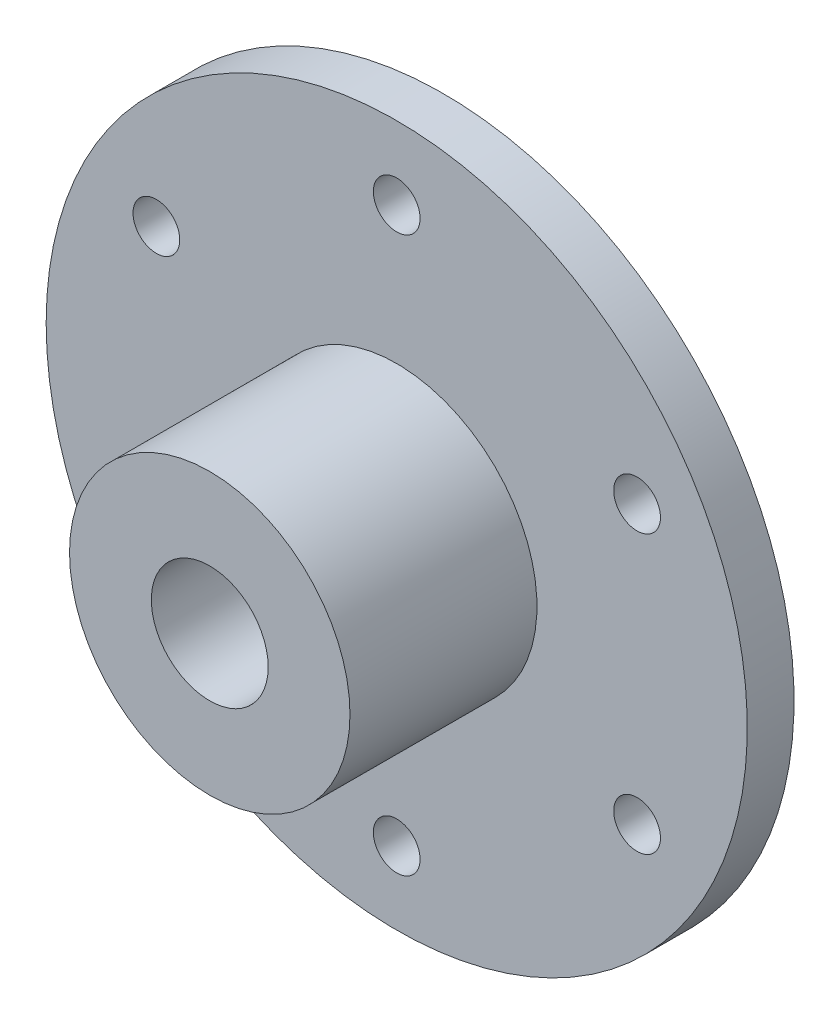
ISO-10303-21;
HEADER;
FILE_DESCRIPTION(('STEP AP214'),'2;1');
FILE_NAME('part.step','',(''),(''),'','','');
FILE_SCHEMA(('AUTOMOTIVE_DESIGN { 1 0 10303 214 1 1 1 1 }'));
ENDSEC;
DATA;
#1=APPLICATION_CONTEXT('core data for automotive mechanical design processes');
#2=APPLICATION_PROTOCOL_DEFINITION('international standard','automotive_design',2000,#1);
#3=PRODUCT_CONTEXT('',#1,'mechanical');
#4=PRODUCT('Part','Part','',(#3));
#5=PRODUCT_RELATED_PRODUCT_CATEGORY('part','',(#4));
#6=PRODUCT_DEFINITION_FORMATION('','',#4);
#7=PRODUCT_DEFINITION_CONTEXT('part definition',#1,'design');
#8=PRODUCT_DEFINITION('design','',#6,#7);
#9=PRODUCT_DEFINITION_SHAPE('','',#8);
#10=(LENGTH_UNIT() NAMED_UNIT(*) SI_UNIT(.MILLI.,.METRE.));
#11=(NAMED_UNIT(*) PLANE_ANGLE_UNIT() SI_UNIT($,.RADIAN.));
#12=(NAMED_UNIT(*) SI_UNIT($,.STERADIAN.) SOLID_ANGLE_UNIT());
#13=UNCERTAINTY_MEASURE_WITH_UNIT(LENGTH_MEASURE(1.E-05),#10,'distance_accuracy_value','');
#14=(GEOMETRIC_REPRESENTATION_CONTEXT(3) GLOBAL_UNCERTAINTY_ASSIGNED_CONTEXT((#13)) GLOBAL_UNIT_ASSIGNED_CONTEXT((#10,
#11,#12)) REPRESENTATION_CONTEXT('',''));
#15=CARTESIAN_POINT('',(0.,0.,0.));
#16=DIRECTION('',(0.,0.,1.));
#17=DIRECTION('',(1.,0.,0.));
#18=AXIS2_PLACEMENT_3D('',#15,#16,#17);
#19=CARTESIAN_POINT('',(0.,0.,-4.));
#20=DIRECTION('',(0.,0.,1.));
#21=DIRECTION('',(1.,0.,0.));
#22=AXIS2_PLACEMENT_3D('',#19,#20,#21);
#23=CYLINDRICAL_SURFACE('',#22,30.);
#24=CARTESIAN_POINT('',(0.,0.,-4.));
#25=DIRECTION('',(0.,0.,1.));
#26=DIRECTION('',(-1.,0.,0.));
#27=AXIS2_PLACEMENT_3D('',#24,#25,#26);
#28=CIRCLE('',#27,30.);
#29=CARTESIAN_POINT('',(-30.,0.,-4.));
#30=VERTEX_POINT('',#29);
#31=EDGE_CURVE('E45',#30,#30,#28,.T.);
#32=ORIENTED_EDGE('',*,*,#31,.T.);
#33=EDGE_LOOP('',(#32));
#34=FACE_BOUND('',#33,.T.);
#35=CARTESIAN_POINT('',(0.,0.,0.));
#36=DIRECTION('',(0.,0.,1.));
#37=DIRECTION('',(-1.,0.,0.));
#38=AXIS2_PLACEMENT_3D('',#35,#36,#37);
#39=CIRCLE('',#38,30.);
#40=CARTESIAN_POINT('',(-30.,0.,0.));
#41=VERTEX_POINT('',#40);
#42=EDGE_CURVE('E49',#41,#41,#39,.T.);
#43=ORIENTED_EDGE('',*,*,#42,.F.);
#44=EDGE_LOOP('',(#43));
#45=FACE_BOUND('',#44,.T.);
#46=ADVANCED_FACE('F31',(#34,#45),#23,.T.);
#47=CARTESIAN_POINT('',(0.,0.,-4.));
#48=DIRECTION('',(0.,0.,-1.));
#49=DIRECTION('',(-1.,0.,0.));
#50=AXIS2_PLACEMENT_3D('',#47,#48,#49);
#51=PLANE('',#50);
#52=CARTESIAN_POINT('',(0.,0.,-4.));
#53=DIRECTION('',(0.,0.,1.));
#54=DIRECTION('',(1.,0.,0.));
#55=AXIS2_PLACEMENT_3D('',#52,#53,#54);
#56=CIRCLE('',#55,4.99999999999999);
#57=CARTESIAN_POINT('',(4.99999999999999,0.,-4.));
#58=VERTEX_POINT('',#57);
#59=EDGE_CURVE('E93',#58,#58,#56,.T.);
#60=ORIENTED_EDGE('',*,*,#59,.T.);
#61=EDGE_LOOP('',(#60));
#62=FACE_BOUND('',#61,.T.);
#63=CARTESIAN_POINT('',(20.5681033398804,-11.875,-4.));
#64=DIRECTION('',(0.,0.,1.));
#65=DIRECTION('',(1.,0.,0.));
#66=AXIS2_PLACEMENT_3D('',#63,#64,#65);
#67=CIRCLE('',#66,1.99999999999999);
#68=CARTESIAN_POINT('',(22.5681033398804,-11.875,-4.));
#69=VERTEX_POINT('',#68);
#70=EDGE_CURVE('E87',#69,#69,#67,.T.);
#71=ORIENTED_EDGE('',*,*,#70,.T.);
#72=EDGE_LOOP('',(#71));
#73=FACE_BOUND('',#72,.T.);
#74=CARTESIAN_POINT('',(0.,23.75,-4.));
#75=DIRECTION('',(0.,0.,1.));
#76=DIRECTION('',(1.,0.,0.));
#77=AXIS2_PLACEMENT_3D('',#74,#75,#76);
#78=CIRCLE('',#77,1.99999999999999);
#79=CARTESIAN_POINT('',(1.99999999999999,23.75,-4.));
#80=VERTEX_POINT('',#79);
#81=EDGE_CURVE('E81',#80,#80,#78,.T.);
#82=ORIENTED_EDGE('',*,*,#81,.T.);
#83=EDGE_LOOP('',(#82));
#84=FACE_BOUND('',#83,.T.);
#85=CARTESIAN_POINT('',(0.,-23.75,-4.));
#86=DIRECTION('',(0.,0.,1.));
#87=DIRECTION('',(1.,0.,0.));
#88=AXIS2_PLACEMENT_3D('',#85,#86,#87);
#89=CIRCLE('',#88,1.99999999999999);
#90=CARTESIAN_POINT('',(1.99999999999999,-23.75,-4.));
#91=VERTEX_POINT('',#90);
#92=EDGE_CURVE('E75',#91,#91,#89,.T.);
#93=ORIENTED_EDGE('',*,*,#92,.T.);
#94=EDGE_LOOP('',(#93));
#95=FACE_BOUND('',#94,.T.);
#96=CARTESIAN_POINT('',(20.5681033398804,11.875,-4.));
#97=DIRECTION('',(0.,0.,1.));
#98=DIRECTION('',(1.,0.,0.));
#99=AXIS2_PLACEMENT_3D('',#96,#97,#98);
#100=CIRCLE('',#99,1.99999999999999);
#101=CARTESIAN_POINT('',(22.5681033398804,11.875,-4.));
#102=VERTEX_POINT('',#101);
#103=EDGE_CURVE('E69',#102,#102,#100,.T.);
#104=ORIENTED_EDGE('',*,*,#103,.T.);
#105=EDGE_LOOP('',(#104));
#106=FACE_BOUND('',#105,.T.);
#107=CARTESIAN_POINT('',(-20.5681033398804,11.875,-4.));
#108=DIRECTION('',(0.,0.,1.));
#109=DIRECTION('',(1.,0.,0.));
#110=AXIS2_PLACEMENT_3D('',#107,#108,#109);
#111=CIRCLE('',#110,1.99999999999999);
#112=CARTESIAN_POINT('',(-18.5681033398804,11.875,-4.));
#113=VERTEX_POINT('',#112);
#114=EDGE_CURVE('E63',#113,#113,#111,.T.);
#115=ORIENTED_EDGE('',*,*,#114,.T.);
#116=EDGE_LOOP('',(#115));
#117=FACE_BOUND('',#116,.T.);
#118=CARTESIAN_POINT('',(-20.5681033398804,-11.875,-4.));
#119=DIRECTION('',(0.,0.,1.));
#120=DIRECTION('',(1.,0.,0.));
#121=AXIS2_PLACEMENT_3D('',#118,#119,#120);
#122=CIRCLE('',#121,1.99999999999999);
#123=CARTESIAN_POINT('',(-18.5681033398804,-11.875,-4.));
#124=VERTEX_POINT('',#123);
#125=EDGE_CURVE('E57',#124,#124,#122,.T.);
#126=ORIENTED_EDGE('',*,*,#125,.T.);
#127=EDGE_LOOP('',(#126));
#128=FACE_BOUND('',#127,.T.);
#129=ORIENTED_EDGE('',*,*,#31,.F.);
#130=EDGE_LOOP('',(#129));
#131=FACE_BOUND('',#130,.T.);
#132=ADVANCED_FACE('F151',(#62,#73,#84,#95,#106,#117,#128,#131),#51,.T.);
#133=CARTESIAN_POINT('',(0.,0.,0.));
#134=DIRECTION('',(0.,0.,-1.));
#135=DIRECTION('',(-1.,0.,0.));
#136=AXIS2_PLACEMENT_3D('',#133,#134,#135);
#137=PLANE('',#136);
#138=CARTESIAN_POINT('',(20.5681033398804,-11.875,0.));
#139=DIRECTION('',(0.,0.,1.));
#140=DIRECTION('',(1.,0.,0.));
#141=AXIS2_PLACEMENT_3D('',#138,#139,#140);
#142=CIRCLE('',#141,1.99999999999999);
#143=CARTESIAN_POINT('',(22.5681033398804,-11.875,0.));
#144=VERTEX_POINT('',#143);
#145=EDGE_CURVE('E90',#144,#144,#142,.T.);
#146=ORIENTED_EDGE('',*,*,#145,.F.);
#147=EDGE_LOOP('',(#146));
#148=FACE_BOUND('',#147,.T.);
#149=CARTESIAN_POINT('',(0.,23.75,0.));
#150=DIRECTION('',(0.,0.,1.));
#151=DIRECTION('',(1.,0.,0.));
#152=AXIS2_PLACEMENT_3D('',#149,#150,#151);
#153=CIRCLE('',#152,1.99999999999999);
#154=CARTESIAN_POINT('',(1.99999999999999,23.75,0.));
#155=VERTEX_POINT('',#154);
#156=EDGE_CURVE('E84',#155,#155,#153,.T.);
#157=ORIENTED_EDGE('',*,*,#156,.F.);
#158=EDGE_LOOP('',(#157));
#159=FACE_BOUND('',#158,.T.);
#160=CARTESIAN_POINT('',(0.,-23.75,0.));
#161=DIRECTION('',(0.,0.,1.));
#162=DIRECTION('',(1.,0.,0.));
#163=AXIS2_PLACEMENT_3D('',#160,#161,#162);
#164=CIRCLE('',#163,1.99999999999999);
#165=CARTESIAN_POINT('',(1.99999999999999,-23.75,0.));
#166=VERTEX_POINT('',#165);
#167=EDGE_CURVE('E78',#166,#166,#164,.T.);
#168=ORIENTED_EDGE('',*,*,#167,.F.);
#169=EDGE_LOOP('',(#168));
#170=FACE_BOUND('',#169,.T.);
#171=CARTESIAN_POINT('',(20.5681033398804,11.875,0.));
#172=DIRECTION('',(0.,0.,1.));
#173=DIRECTION('',(1.,0.,0.));
#174=AXIS2_PLACEMENT_3D('',#171,#172,#173);
#175=CIRCLE('',#174,1.99999999999999);
#176=CARTESIAN_POINT('',(22.5681033398804,11.875,0.));
#177=VERTEX_POINT('',#176);
#178=EDGE_CURVE('E72',#177,#177,#175,.T.);
#179=ORIENTED_EDGE('',*,*,#178,.F.);
#180=EDGE_LOOP('',(#179));
#181=FACE_BOUND('',#180,.T.);
#182=CARTESIAN_POINT('',(-20.5681033398804,11.875,0.));
#183=DIRECTION('',(0.,0.,1.));
#184=DIRECTION('',(1.,0.,0.));
#185=AXIS2_PLACEMENT_3D('',#182,#183,#184);
#186=CIRCLE('',#185,1.99999999999999);
#187=CARTESIAN_POINT('',(-18.5681033398804,11.875,0.));
#188=VERTEX_POINT('',#187);
#189=EDGE_CURVE('E66',#188,#188,#186,.T.);
#190=ORIENTED_EDGE('',*,*,#189,.F.);
#191=EDGE_LOOP('',(#190));
#192=FACE_BOUND('',#191,.T.);
#193=CARTESIAN_POINT('',(-20.5681033398804,-11.875,0.));
#194=DIRECTION('',(0.,0.,1.));
#195=DIRECTION('',(1.,0.,0.));
#196=AXIS2_PLACEMENT_3D('',#193,#194,#195);
#197=CIRCLE('',#196,1.99999999999999);
#198=CARTESIAN_POINT('',(-18.5681033398804,-11.875,0.));
#199=VERTEX_POINT('',#198);
#200=EDGE_CURVE('E60',#199,#199,#197,.T.);
#201=ORIENTED_EDGE('',*,*,#200,.F.);
#202=EDGE_LOOP('',(#201));
#203=FACE_BOUND('',#202,.T.);
#204=CARTESIAN_POINT('',(0.,0.,0.));
#205=DIRECTION('',(0.,0.,-1.));
#206=DIRECTION('',(-1.,0.,0.));
#207=AXIS2_PLACEMENT_3D('',#204,#205,#206);
#208=CIRCLE('',#207,12.);
#209=CARTESIAN_POINT('',(-12.,0.,0.));
#210=VERTEX_POINT('',#209);
#211=EDGE_CURVE('E41',#210,#210,#208,.F.);
#212=ORIENTED_EDGE('',*,*,#211,.F.);
#213=EDGE_LOOP('',(#212));
#214=FACE_BOUND('',#213,.T.);
#215=ORIENTED_EDGE('',*,*,#42,.T.);
#216=EDGE_LOOP('',(#215));
#217=FACE_BOUND('',#216,.T.);
#218=ADVANCED_FACE('F146',(#148,#159,#170,#181,#192,#203,#214,#217),#137,.F.);
#219=CARTESIAN_POINT('',(0.,0.,16.));
#220=DIRECTION('',(0.,0.,-1.));
#221=DIRECTION('',(-1.,0.,0.));
#222=AXIS2_PLACEMENT_3D('',#219,#220,#221);
#223=CYLINDRICAL_SURFACE('',#222,12.);
#224=CARTESIAN_POINT('',(0.,-12.,9.99999999999999));
#225=CARTESIAN_POINT('',(0.111512723966572,-11.9999980893506,9.99999552884174));
#226=CARTESIAN_POINT('',(0.223086305471056,-11.9984294233043,9.99064218002485));
#227=CARTESIAN_POINT('',(0.443104177338432,-11.9923227595311,9.95349147298773));
#228=CARTESIAN_POINT('',(0.551545494367395,-11.9877820313911,9.92567715447071));
#229=CARTESIAN_POINT('',(0.762083797770111,-11.9762405458916,9.85246764112579));
#230=CARTESIAN_POINT('',(0.864185894745516,-11.9692418012735,9.80708682748753));
#231=CARTESIAN_POINT('',(1.05931347358235,-11.9535538166566,9.70007016635807));
#232=CARTESIAN_POINT('',(1.15233999190287,-11.9448647700355,9.63843617801359));
#233=CARTESIAN_POINT('',(1.32757809143334,-11.9266665396665,9.50003593294362));
#234=CARTESIAN_POINT('',(1.40969032282797,-11.9171509745189,9.42314470829109));
#235=CARTESIAN_POINT('',(1.55991079892793,-11.8984210150139,9.25668162522174));
#236=CARTESIAN_POINT('',(1.62801815951277,-11.8892066397013,9.1671089668347));
#237=CARTESIAN_POINT('',(1.7486937004841,-11.8720605260782,8.97714322704235));
#238=CARTESIAN_POINT('',(1.80116364228879,-11.8641370327331,8.87668693055619));
#239=CARTESIAN_POINT('',(1.88844669232896,-11.8505583183574,8.6682323485595));
#240=CARTESIAN_POINT('',(1.92326099325248,-11.8449029441145,8.56023457305789));
#241=CARTESIAN_POINT('',(1.97393150222783,-11.836564294742,8.34081578011477));
#242=CARTESIAN_POINT('',(1.98995922330831,-11.8338541478856,8.22943541079889));
#243=CARTESIAN_POINT('',(2.00313338023189,-11.8316315114932,8.00553577849322));
#244=CARTESIAN_POINT('',(2.00028115231119,-11.8321187956577,7.89301659666616));
#245=CARTESIAN_POINT('',(1.97591607871691,-11.8362114309084,7.67125771097964));
#246=CARTESIAN_POINT('',(1.95459590551181,-11.8397845865513,7.56199615716382));
#247=CARTESIAN_POINT('',(1.89420251232274,-11.8495959616881,7.3486229457367));
#248=CARTESIAN_POINT('',(1.85512868345578,-11.8558342725862,7.24451146488917));
#249=CARTESIAN_POINT('',(1.76014179687512,-11.8703078346728,7.04381694124727));
#250=CARTESIAN_POINT('',(1.70414873110376,-11.8785525368586,6.94727247513503));
#251=CARTESIAN_POINT('',(1.57696961404594,-11.8961033473201,6.7648764795693));
#252=CARTESIAN_POINT('',(1.50578233652342,-11.9054095412343,6.67902581403606));
#253=CARTESIAN_POINT('',(1.34918576972723,-11.9241762230383,6.51933913135413));
#254=CARTESIAN_POINT('',(1.26361117109849,-11.9336371938532,6.44566518516794));
#255=CARTESIAN_POINT('',(1.08122819918531,-11.9515408111738,6.31369778986774));
#256=CARTESIAN_POINT('',(0.984419753525132,-11.959983451118,6.25540443985343));
#257=CARTESIAN_POINT('',(0.782164732933365,-11.9749111431433,6.15583821829099));
#258=CARTESIAN_POINT('',(0.676710980451725,-11.9813945472596,6.11457966453501));
#259=CARTESIAN_POINT('',(0.460238676482183,-11.9916600241013,6.05040462780323));
#260=CARTESIAN_POINT('',(0.349220591343573,-11.9954423228038,6.02748661042104));
#261=CARTESIAN_POINT('',(0.126167921041299,-11.9998490387415,6.0008629132311));
#262=CARTESIAN_POINT('',(0.0141605897208092,-12.0005100241023,5.99693474255553));
#263=CARTESIAN_POINT('',(-0.208911818311909,-11.9986997953694,6.00780907554251));
#264=CARTESIAN_POINT('',(-0.319976931113629,-11.9962287017929,6.022610858507));
#265=CARTESIAN_POINT('',(-0.537324940437407,-11.9884546155056,6.07033987946839));
#266=CARTESIAN_POINT('',(-0.643632694708299,-11.9831688384105,6.10315696671211));
#267=CARTESIAN_POINT('',(-0.849237507888349,-11.9703557156429,6.18586761455964));
#268=CARTESIAN_POINT('',(-0.948534172727769,-11.9628282440962,6.23576213410823));
#269=CARTESIAN_POINT('',(-1.13826455157516,-11.9462761304193,6.35172089975744));
#270=CARTESIAN_POINT('',(-1.22861220074971,-11.9372388470962,6.41792412493381));
#271=CARTESIAN_POINT('',(-1.39699486840214,-11.9187077391352,6.56442985230806));
#272=CARTESIAN_POINT('',(-1.47502899175726,-11.9092138813724,6.64473337862134));
#273=CARTESIAN_POINT('',(-1.61739422372639,-11.8907214018868,6.81815803845715));
#274=CARTESIAN_POINT('',(-1.68157500889096,-11.8817289290968,6.91140333241153));
#275=CARTESIAN_POINT('',(-1.79336184823598,-11.8653722382231,7.10748237531084));
#276=CARTESIAN_POINT('',(-1.84096842781585,-11.8580079685282,7.210315820182));
#277=CARTESIAN_POINT('',(-1.91803066517851,-11.8457876295816,7.42223178624971));
#278=CARTESIAN_POINT('',(-1.94756114603834,-11.8409212344885,7.53128647602439));
#279=CARTESIAN_POINT('',(-1.98786836302261,-11.8342217346821,7.75289610337741));
#280=CARTESIAN_POINT('',(-1.99864672955692,-11.8323883662618,7.86545073578564));
#281=CARTESIAN_POINT('',(-2.00109829283787,-11.8319738646721,8.08936413276992));
#282=CARTESIAN_POINT('',(-1.99300810890014,-11.8333524520452,8.20072030286023));
#283=CARTESIAN_POINT('',(-1.95846387116547,-11.8391182516298,8.42046339844061));
#284=CARTESIAN_POINT('',(-1.93200987688997,-11.8435054540897,8.52885033355349));
#285=CARTESIAN_POINT('',(-1.86157959167591,-11.8547788502538,8.73948674983409));
#286=CARTESIAN_POINT('',(-1.81762367248034,-11.8616621377574,8.84174320804481));
#287=CARTESIAN_POINT('',(-1.71346160313272,-11.8771549513777,9.03746853535587));
#288=CARTESIAN_POINT('',(-1.65325464699884,-11.8857645631072,9.1309369682977));
#289=CARTESIAN_POINT('',(-1.51745510749771,-11.903867632365,9.30762846648619));
#290=CARTESIAN_POINT('',(-1.44168845087491,-11.9133703646104,9.39071681336021));
#291=CARTESIAN_POINT('',(-1.27728722510418,-11.9321149788867,9.54308128357994));
#292=CARTESIAN_POINT('',(-1.1886496903301,-11.9413568002124,9.61235421491053));
#293=CARTESIAN_POINT('',(-1.00029533571222,-11.9586122371378,9.73555861455995));
#294=CARTESIAN_POINT('',(-0.900506230026249,-11.9666169300248,9.78938083145035));
#295=CARTESIAN_POINT('',(-0.69321045550318,-11.9804093408142,9.87941558768792));
#296=CARTESIAN_POINT('',(-0.585711595864004,-11.9861992654199,9.91564566486375));
#297=CARTESIAN_POINT('',(-0.398162648036317,-11.9936463266636,9.96160421930132));
#298=CARTESIAN_POINT('',(-0.319247064238755,-11.9960162181869,9.97597957569276));
#299=CARTESIAN_POINT('',(-0.160231448255846,-11.999193727889,9.99517899027579));
#300=CARTESIAN_POINT('',(-0.0801314364867944,-12.0000013729651,10.0000032129099));
#301=CARTESIAN_POINT('',(0.,-12.,9.99999999999999));
#302=B_SPLINE_CURVE_WITH_KNOTS('',3,(#224,#225,#226,#227,#228,#229,#230,#231,#232,#233,#234,
#235,#236,#237,#238,#239,#240,#241,#242,#243,#244,#245,#246,#247,#248,#249,#250,#251,#252,#253,
#254,#255,#256,#257,#258,#259,#260,#261,#262,#263,#264,#265,#266,#267,#268,#269,#270,#271,#272,
#273,#274,#275,#276,#277,#278,#279,#280,#281,#282,#283,#284,#285,#286,#287,#288,#289,#290,#291,
#292,#293,#294,#295,#296,#297,#298,#299,#300,#301),.UNSPECIFIED.,.T.,.F.,(4,2,2,2,2,2,2,2,2,2,2,
2,2,2,2,2,2,2,2,2,2,2,2,2,2,2,2,2,2,2,2,2,2,2,2,2,2,2,4),(0.,0.334245267950805,
0.668798036556332,1.00307749362021,1.33731873013982,1.67441992849865,2.01154240135884,
2.3507401665907,2.68991501500943,3.02596861682737,3.36199843456707,3.69456417408325,
4.02714132020302,4.36131645306043,4.69551856544456,5.03386215929058,5.37220793308675,
5.71083751132719,6.04943875616915,6.38406306793114,6.71867450428684,7.05126245605128,
7.38386908660849,7.71941460501614,8.05498450443421,8.3940305760609,8.73306589900749,
9.07068817873412,9.40828110229288,9.74166327618154,10.075044369505,10.4080385458097,
10.7410492402346,11.0780110735471,11.4150506710317,11.7544178528575,12.0934460170405,
12.3336339853121,12.5738178182157),.UNSPECIFIED.);
#303=CARTESIAN_POINT('',(0.,-12.,9.99999999999999));
#304=VERTEX_POINT('',#303);
#305=EDGE_CURVE('E99',#304,#304,#302,.T.);
#306=ORIENTED_EDGE('',*,*,#305,.T.);
#307=EDGE_LOOP('',(#306));
#308=FACE_BOUND('',#307,.T.);
#309=CARTESIAN_POINT('',(0.,0.,16.));
#310=DIRECTION('',(0.,0.,1.));
#311=DIRECTION('',(1.,0.,0.));
#312=AXIS2_PLACEMENT_3D('',#309,#310,#311);
#313=CIRCLE('',#312,12.);
#314=CARTESIAN_POINT('',(12.,0.,16.));
#315=VERTEX_POINT('',#314);
#316=EDGE_CURVE('E53',#315,#315,#313,.T.);
#317=ORIENTED_EDGE('',*,*,#316,.F.);
#318=EDGE_LOOP('',(#317));
#319=FACE_BOUND('',#318,.T.);
#320=ORIENTED_EDGE('',*,*,#211,.T.);
#321=EDGE_LOOP('',(#320));
#322=FACE_BOUND('',#321,.T.);
#323=ADVANCED_FACE('F104',(#308,#319,#322),#223,.T.);
#324=CARTESIAN_POINT('',(0.,0.,16.));
#325=DIRECTION('',(0.,0.,1.));
#326=DIRECTION('',(1.,0.,0.));
#327=AXIS2_PLACEMENT_3D('',#324,#325,#326);
#328=PLANE('',#327);
#329=CARTESIAN_POINT('',(0.,0.,16.));
#330=DIRECTION('',(0.,0.,1.));
#331=DIRECTION('',(1.,0.,0.));
#332=AXIS2_PLACEMENT_3D('',#329,#330,#331);
#333=CIRCLE('',#332,4.99999999999999);
#334=CARTESIAN_POINT('',(4.99999999999999,0.,16.));
#335=VERTEX_POINT('',#334);
#336=EDGE_CURVE('E96',#335,#335,#333,.T.);
#337=ORIENTED_EDGE('',*,*,#336,.F.);
#338=EDGE_LOOP('',(#337));
#339=FACE_BOUND('',#338,.T.);
#340=ORIENTED_EDGE('',*,*,#316,.T.);
#341=EDGE_LOOP('',(#340));
#342=FACE_BOUND('',#341,.T.);
#343=ADVANCED_FACE('F139',(#339,#342),#328,.T.);
#344=CARTESIAN_POINT('',(-20.5681033398804,-11.875,0.));
#345=DIRECTION('',(0.,0.,1.));
#346=DIRECTION('',(1.,0.,0.));
#347=AXIS2_PLACEMENT_3D('',#344,#345,#346);
#348=CYLINDRICAL_SURFACE('',#347,1.99999999999999);
#349=ORIENTED_EDGE('',*,*,#125,.F.);
#350=EDGE_LOOP('',(#349));
#351=FACE_BOUND('',#350,.T.);
#352=ORIENTED_EDGE('',*,*,#200,.T.);
#353=EDGE_LOOP('',(#352));
#354=FACE_BOUND('',#353,.T.);
#355=ADVANCED_FACE('F136',(#351,#354),#348,.F.);
#356=CARTESIAN_POINT('',(-20.5681033398804,11.875,0.));
#357=DIRECTION('',(0.,0.,1.));
#358=DIRECTION('',(1.,0.,0.));
#359=AXIS2_PLACEMENT_3D('',#356,#357,#358);
#360=CYLINDRICAL_SURFACE('',#359,1.99999999999999);
#361=ORIENTED_EDGE('',*,*,#114,.F.);
#362=EDGE_LOOP('',(#361));
#363=FACE_BOUND('',#362,.T.);
#364=ORIENTED_EDGE('',*,*,#189,.T.);
#365=EDGE_LOOP('',(#364));
#366=FACE_BOUND('',#365,.T.);
#367=ADVANCED_FACE('F132',(#363,#366),#360,.F.);
#368=CARTESIAN_POINT('',(20.5681033398804,11.875,0.));
#369=DIRECTION('',(0.,0.,1.));
#370=DIRECTION('',(1.,0.,0.));
#371=AXIS2_PLACEMENT_3D('',#368,#369,#370);
#372=CYLINDRICAL_SURFACE('',#371,1.99999999999999);
#373=ORIENTED_EDGE('',*,*,#103,.F.);
#374=EDGE_LOOP('',(#373));
#375=FACE_BOUND('',#374,.T.);
#376=ORIENTED_EDGE('',*,*,#178,.T.);
#377=EDGE_LOOP('',(#376));
#378=FACE_BOUND('',#377,.T.);
#379=ADVANCED_FACE('F128',(#375,#378),#372,.F.);
#380=CARTESIAN_POINT('',(0.,-23.75,0.));
#381=DIRECTION('',(0.,0.,1.));
#382=DIRECTION('',(1.,0.,0.));
#383=AXIS2_PLACEMENT_3D('',#380,#381,#382);
#384=CYLINDRICAL_SURFACE('',#383,1.99999999999999);
#385=ORIENTED_EDGE('',*,*,#92,.F.);
#386=EDGE_LOOP('',(#385));
#387=FACE_BOUND('',#386,.T.);
#388=ORIENTED_EDGE('',*,*,#167,.T.);
#389=EDGE_LOOP('',(#388));
#390=FACE_BOUND('',#389,.T.);
#391=ADVANCED_FACE('F124',(#387,#390),#384,.F.);
#392=CARTESIAN_POINT('',(0.,23.75,0.));
#393=DIRECTION('',(0.,0.,1.));
#394=DIRECTION('',(1.,0.,0.));
#395=AXIS2_PLACEMENT_3D('',#392,#393,#394);
#396=CYLINDRICAL_SURFACE('',#395,1.99999999999999);
#397=ORIENTED_EDGE('',*,*,#81,.F.);
#398=EDGE_LOOP('',(#397));
#399=FACE_BOUND('',#398,.T.);
#400=ORIENTED_EDGE('',*,*,#156,.T.);
#401=EDGE_LOOP('',(#400));
#402=FACE_BOUND('',#401,.T.);
#403=ADVANCED_FACE('F120',(#399,#402),#396,.F.);
#404=CARTESIAN_POINT('',(20.5681033398804,-11.875,0.));
#405=DIRECTION('',(0.,0.,1.));
#406=DIRECTION('',(1.,0.,0.));
#407=AXIS2_PLACEMENT_3D('',#404,#405,#406);
#408=CYLINDRICAL_SURFACE('',#407,1.99999999999999);
#409=ORIENTED_EDGE('',*,*,#70,.F.);
#410=EDGE_LOOP('',(#409));
#411=FACE_BOUND('',#410,.T.);
#412=ORIENTED_EDGE('',*,*,#145,.T.);
#413=EDGE_LOOP('',(#412));
#414=FACE_BOUND('',#413,.T.);
#415=ADVANCED_FACE('F117',(#411,#414),#408,.F.);
#416=CARTESIAN_POINT('',(0.,0.,16.));
#417=DIRECTION('',(0.,0.,1.));
#418=DIRECTION('',(1.,0.,0.));
#419=AXIS2_PLACEMENT_3D('',#416,#417,#418);
#420=CYLINDRICAL_SURFACE('',#419,4.99999999999999);
#421=CARTESIAN_POINT('',(0.,-4.99999999999999,9.99999999999999));
#422=CARTESIAN_POINT('',(-0.10749300544289,-4.99999271227083,9.99999014817626));
#423=CARTESIAN_POINT('',(-0.215172564090672,-4.99649294306931,9.99128224791161));
#424=CARTESIAN_POINT('',(-0.427496480417893,-4.9828345310064,9.95675229647875));
#425=CARTESIAN_POINT('',(-0.532131777561244,-4.97265778698876,9.93088372091385));
#426=CARTESIAN_POINT('',(-0.734953922727398,-4.94674209213117,9.86312392194116));
#427=CARTESIAN_POINT('',(-0.833160661616953,-4.93102136364071,9.82128515378326));
#428=CARTESIAN_POINT('',(-1.02107197032836,-4.89556610796077,9.72298082667344));
#429=CARTESIAN_POINT('',(-1.11077947675098,-4.87583297458055,9.66652034508106));
#430=CARTESIAN_POINT('',(-1.28350100757039,-4.83330886170417,9.53776450143905));
#431=CARTESIAN_POINT('',(-1.3660622725502,-4.81042296929189,9.46489334375973));
#432=CARTESIAN_POINT('',(-1.51817500478471,-4.76460576906193,9.30659999652321));
#433=CARTESIAN_POINT('',(-1.58772010713352,-4.74167444453791,9.22117170278825));
#434=CARTESIAN_POINT('',(-1.71487456729287,-4.69722791797135,9.03557192975772));
#435=CARTESIAN_POINT('',(-1.77181498119546,-4.6758211596495,8.9349135139768));
#436=CARTESIAN_POINT('',(-1.86775471903714,-4.63833647186792,8.72446360157995));
#437=CARTESIAN_POINT('',(-1.90676256428582,-4.62225601244175,8.61467647215163));
#438=CARTESIAN_POINT('',(-1.96389882339585,-4.59826357660818,8.39428766640789));
#439=CARTESIAN_POINT('',(-1.98289396580563,-4.59001420355604,8.28394876442378));
#440=CARTESIAN_POINT('',(-2.00217296164002,-4.58164004049143,8.06136500169273));
#441=CARTESIAN_POINT('',(-2.00246601631321,-4.58151125522767,7.94912110537499));
#442=CARTESIAN_POINT('',(-1.98498936750453,-4.58910500279993,7.73424332854196));
#443=CARTESIAN_POINT('',(-1.96847531430512,-4.59628175038449,7.63148428559097));
#444=CARTESIAN_POINT('',(-1.91994688029781,-4.61676187607835,7.43034044399329));
#445=CARTESIAN_POINT('',(-1.88792979480462,-4.63006632321672,7.3319564118897));
#446=CARTESIAN_POINT('',(-1.80869473255106,-4.66159485088529,7.13998216380396));
#447=CARTESIAN_POINT('',(-1.76117986231531,-4.67991379280787,7.04653076094532));
#448=CARTESIAN_POINT('',(-1.6525064607322,-4.71938116389889,6.86858418363844));
#449=CARTESIAN_POINT('',(-1.59134280510083,-4.74053065456847,6.7840923905972));
#450=CARTESIAN_POINT('',(-1.45155059945442,-4.7852673674227,6.61959027119801));
#451=CARTESIAN_POINT('',(-1.37193746297063,-4.80891664976151,6.54043127055399));
#452=CARTESIAN_POINT('',(-1.20031442743018,-4.85459824958281,6.39631552199797));
#453=CARTESIAN_POINT('',(-1.10830206533443,-4.87663024445324,6.33136160258972));
#454=CARTESIAN_POINT('',(-0.912077652605836,-4.91714681264547,6.21638255258418));
#455=CARTESIAN_POINT('',(-0.807660491346471,-4.93555270095414,6.16667771880296));
#456=CARTESIAN_POINT('',(-0.591023765482877,-4.96614828328758,6.08583213892196));
#457=CARTESIAN_POINT('',(-0.47880819684967,-4.97834113462381,6.0546819624426));
#458=CARTESIAN_POINT('',(-0.256895887607817,-4.99456139506909,6.01355170458031));
#459=CARTESIAN_POINT('',(-0.147443293985532,-4.99902945833513,6.00242754574645));
#460=CARTESIAN_POINT('',(0.071845309807818,-5.0006847851063,5.9982868994714));
#461=CARTESIAN_POINT('',(0.181681213223924,-4.9978739358229,6.0052657184525));
#462=CARTESIAN_POINT('',(0.393432739121986,-4.98557567063752,6.036291752552));
#463=CARTESIAN_POINT('',(0.495482491775473,-4.97639391345522,6.05955798035099));
#464=CARTESIAN_POINT('',(0.694135428060778,-4.95259441405499,6.12143570830983));
#465=CARTESIAN_POINT('',(0.790737910224841,-4.93797597356529,6.16004917966869));
#466=CARTESIAN_POINT('',(0.979078785816698,-4.9041659477081,6.25278493967996));
#467=CARTESIAN_POINT('',(1.0705780227554,-4.88484815979802,6.30734547204316));
#468=CARTESIAN_POINT('',(1.24344359124655,-4.84373364745523,6.42994032390566));
#469=CARTESIAN_POINT('',(1.32480584076112,-4.82193593110269,6.49798004292262));
#470=CARTESIAN_POINT('',(1.48072304302881,-4.77645117638111,6.65087001294964));
#471=CARTESIAN_POINT('',(1.55447393380606,-4.75273441425051,6.73653354150622));
#472=CARTESIAN_POINT('',(1.6867511974137,-4.70741672917131,6.91944008300938));
#473=CARTESIAN_POINT('',(1.7452750613375,-4.6858161552651,7.01668500033996));
#474=CARTESIAN_POINT('',(1.84580750193162,-4.64714299907707,7.22146169459411));
#475=CARTESIAN_POINT('',(1.88765059453444,-4.63011630884787,7.32908399921232));
#476=CARTESIAN_POINT('',(1.95229621970529,-4.60323673477931,7.55073365171516));
#477=CARTESIAN_POINT('',(1.9751128052693,-4.59337855695997,7.66475620581243));
#478=CARTESIAN_POINT('',(1.99971561727839,-4.58271759299925,7.88712790177454));
#479=CARTESIAN_POINT('',(2.00289708230286,-4.5813142100817,7.99529483959335));
#480=CARTESIAN_POINT('',(1.99180315927751,-4.58614836033097,8.21054485771329));
#481=CARTESIAN_POINT('',(1.97752998791377,-4.59238492324793,8.31762807390258));
#482=CARTESIAN_POINT('',(1.93307136615364,-4.6112664907902,8.52333218985504));
#483=CARTESIAN_POINT('',(1.90353749357097,-4.62364831827448,8.62212027443299));
#484=CARTESIAN_POINT('',(1.830005448491,-4.65324001232696,8.81337862961348));
#485=CARTESIAN_POINT('',(1.7860032813938,-4.67045121206006,8.90584714689982));
#486=CARTESIAN_POINT('',(1.68187276275972,-4.7089860960449,9.08760961927077));
#487=CARTESIAN_POINT('',(1.62096533515948,-4.73048882313241,9.17641867013048));
#488=CARTESIAN_POINT('',(1.48589211927149,-4.77463804372236,9.34299331720375));
#489=CARTESIAN_POINT('',(1.41172233481811,-4.79728488048405,9.42075557212831));
#490=CARTESIAN_POINT('',(1.24650550627245,-4.84293567087393,9.5682028532636));
#491=CARTESIAN_POINT('',(1.15467600114613,-4.86586757962184,9.63703730689806));
#492=CARTESIAN_POINT('',(0.959900320285773,-4.90800406713716,9.75833704262163));
#493=CARTESIAN_POINT('',(0.856949004547232,-4.92720691092905,9.81079471215252));
#494=CARTESIAN_POINT('',(0.644738062495199,-4.9593971481586,9.89662221519028));
#495=CARTESIAN_POINT('',(0.535631618219693,-4.97249363055027,9.93032932356033));
#496=CARTESIAN_POINT('',(0.312876546281218,-4.99144306209364,9.97863912095425));
#497=CARTESIAN_POINT('',(0.199243525858911,-4.99731899495636,9.99330243674389));
#498=CARTESIAN_POINT('',(0.0569122978909285,-4.99975899504135,9.99939538097826));
#499=CARTESIAN_POINT('',(0.0284626887407581,-5.00000192969174,10.0000026086292));
#500=CARTESIAN_POINT('',(0.,-4.99999999999999,9.99999999999999));
#501=B_SPLINE_CURVE_WITH_KNOTS('',3,(#421,#422,#423,#424,#425,#426,#427,#428,#429,#430,#431,
#432,#433,#434,#435,#436,#437,#438,#439,#440,#441,#442,#443,#444,#445,#446,#447,#448,#449,#450,
#451,#452,#453,#454,#455,#456,#457,#458,#459,#460,#461,#462,#463,#464,#465,#466,#467,#468,#469,
#470,#471,#472,#473,#474,#475,#476,#477,#478,#479,#480,#481,#482,#483,#484,#485,#486,#487,#488,
#489,#490,#491,#492,#493,#494,#495,#496,#497,#498,#499,#500),.UNSPECIFIED.,.T.,.F.,(4,2,2,2,2,2,
2,2,2,2,2,2,2,2,2,2,2,2,2,2,2,2,2,2,2,2,2,2,2,2,2,2,2,2,2,2,2,2,2,4),(0.,0.322402987893069,
0.645683636007931,0.967911457471574,1.29002753567983,1.62597381700396,1.9620839493441,
2.31315258819216,2.66405423118267,2.99904105308827,3.33386306340486,3.6453832840137,
3.95695787256045,4.27489126298813,4.5929442193818,4.93558349186554,5.27829092839729,
5.62776913162803,5.97706956113787,6.30569184528004,6.63422893570078,6.94800455564361,
7.26182048993792,7.58523513398258,7.90877959498964,8.25368474624409,8.59864669043743,
8.94695045140822,9.29499672645928,9.61799673392742,9.9409557256304,10.2511431854876,
10.5614163580516,10.8894546805669,11.2175920134839,11.5670042353383,11.9165786364053,
12.2596430101331,12.6016125240433,12.6869804589679),.UNSPECIFIED.);
#502=CARTESIAN_POINT('',(0.,-4.99999999999999,9.99999999999999));
#503=VERTEX_POINT('',#502);
#504=EDGE_CURVE('E10',#503,#503,#501,.T.);
#505=ORIENTED_EDGE('',*,*,#504,.T.);
#506=EDGE_LOOP('',(#505));
#507=FACE_BOUND('',#506,.T.);
#508=ORIENTED_EDGE('',*,*,#59,.F.);
#509=EDGE_LOOP('',(#508));
#510=FACE_BOUND('',#509,.T.);
#511=ORIENTED_EDGE('',*,*,#336,.T.);
#512=EDGE_LOOP('',(#511));
#513=FACE_BOUND('',#512,.T.);
#514=ADVANCED_FACE('F111',(#507,#510,#513),#420,.F.);
#515=CARTESIAN_POINT('',(0.,-4.58257569495584,8.));
#516=DIRECTION('',(0.,1.,0.));
#517=DIRECTION('',(0.,0.,1.));
#518=AXIS2_PLACEMENT_3D('',#515,#516,#517);
#519=CYLINDRICAL_SURFACE('',#518,1.99999999999999);
#520=ORIENTED_EDGE('',*,*,#504,.F.);
#521=EDGE_LOOP('',(#520));
#522=FACE_BOUND('',#521,.T.);
#523=ORIENTED_EDGE('',*,*,#305,.F.);
#524=EDGE_LOOP('',(#523));
#525=FACE_BOUND('',#524,.T.);
#526=ADVANCED_FACE('F108',(#522,#525),#519,.F.);
#527=CLOSED_SHELL('',(#46,#132,#218,#323,#343,#355,#367,#379,#391,#403,#415,#514,#526));
#528=MANIFOLD_SOLID_BREP('B2',#527);
#529=ADVANCED_BREP_SHAPE_REPRESENTATION('',(#18,#528),#14);
#530=SHAPE_DEFINITION_REPRESENTATION(#9,#529);
ENDSEC;
END-ISO-10303-21;
